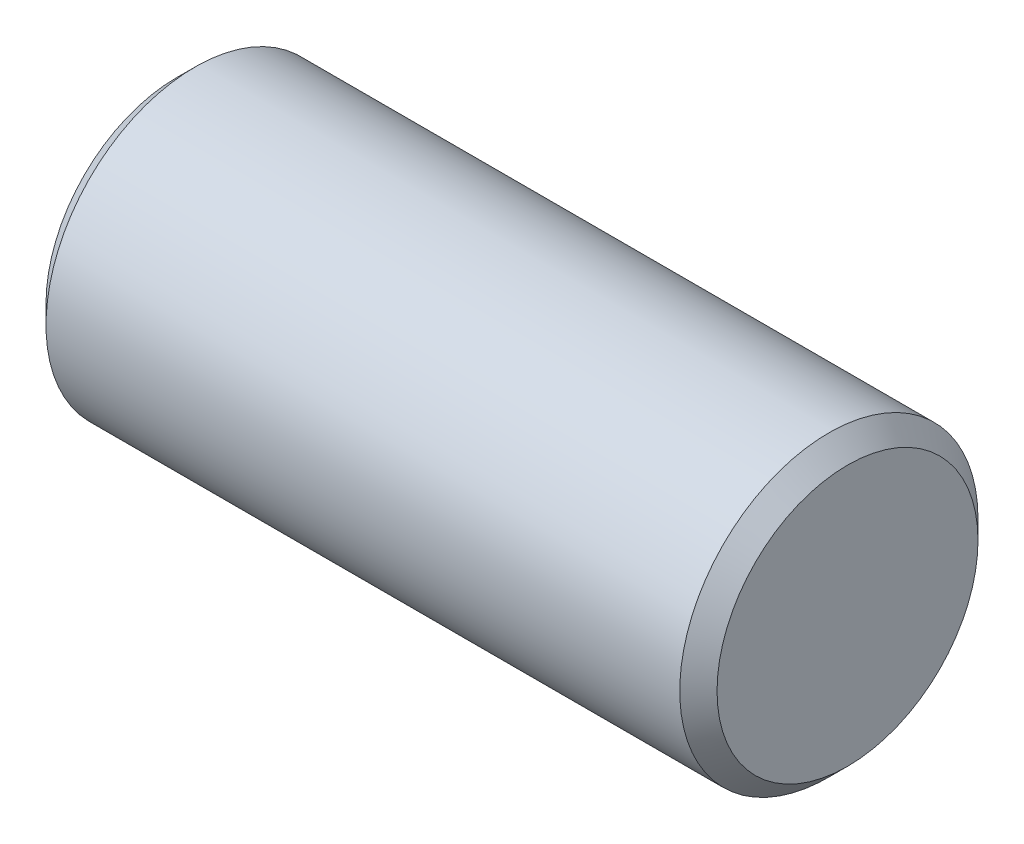
ISO-10303-21;
HEADER;
FILE_DESCRIPTION(('STEP AP214'),'2;1');
FILE_NAME('part.step','',(''),(''),'','','');
FILE_SCHEMA(('AUTOMOTIVE_DESIGN { 1 0 10303 214 1 1 1 1 }'));
ENDSEC;
DATA;
#1=APPLICATION_CONTEXT('core data for automotive mechanical design processes');
#2=APPLICATION_PROTOCOL_DEFINITION('international standard','automotive_design',2000,#1);
#3=PRODUCT_CONTEXT('',#1,'mechanical');
#4=PRODUCT('Part','Part','',(#3));
#5=PRODUCT_RELATED_PRODUCT_CATEGORY('part','',(#4));
#6=PRODUCT_DEFINITION_FORMATION('','',#4);
#7=PRODUCT_DEFINITION_CONTEXT('part definition',#1,'design');
#8=PRODUCT_DEFINITION('design','',#6,#7);
#9=PRODUCT_DEFINITION_SHAPE('','',#8);
#10=(LENGTH_UNIT() NAMED_UNIT(*) SI_UNIT(.MILLI.,.METRE.));
#11=(NAMED_UNIT(*) PLANE_ANGLE_UNIT() SI_UNIT($,.RADIAN.));
#12=(NAMED_UNIT(*) SI_UNIT($,.STERADIAN.) SOLID_ANGLE_UNIT());
#13=UNCERTAINTY_MEASURE_WITH_UNIT(LENGTH_MEASURE(1.E-05),#10,'distance_accuracy_value','');
#14=(GEOMETRIC_REPRESENTATION_CONTEXT(3) GLOBAL_UNCERTAINTY_ASSIGNED_CONTEXT((#13)) GLOBAL_UNIT_ASSIGNED_CONTEXT((#10,
#11,#12)) REPRESENTATION_CONTEXT('',''));
#15=CARTESIAN_POINT('',(0.,0.,0.));
#16=DIRECTION('',(0.,0.,1.));
#17=DIRECTION('',(1.,0.,0.));
#18=AXIS2_PLACEMENT_3D('',#15,#16,#17);
#19=CARTESIAN_POINT('',(18.,0.,0.));
#20=DIRECTION('',(-1.,0.,0.));
#21=DIRECTION('',(0.,0.,1.));
#22=AXIS2_PLACEMENT_3D('',#19,#20,#21);
#23=CYLINDRICAL_SURFACE('',#22,4.);
#24=CARTESIAN_POINT('',(17.5,0.,0.));
#25=DIRECTION('',(1.,0.,0.));
#26=DIRECTION('',(0.,0.,-1.));
#27=AXIS2_PLACEMENT_3D('',#24,#25,#26);
#28=CIRCLE('',#27,4.);
#29=CARTESIAN_POINT('',(17.5,0.,-4.));
#30=VERTEX_POINT('',#29);
#31=EDGE_CURVE('E48',#30,#30,#28,.F.);
#32=ORIENTED_EDGE('',*,*,#31,.T.);
#33=EDGE_LOOP('',(#32));
#34=FACE_BOUND('',#33,.T.);
#35=CARTESIAN_POINT('',(0.5,0.,0.));
#36=DIRECTION('',(1.,0.,0.));
#37=DIRECTION('',(0.,0.,-1.));
#38=AXIS2_PLACEMENT_3D('',#35,#36,#37);
#39=CIRCLE('',#38,4.);
#40=CARTESIAN_POINT('',(0.5,0.,-4.));
#41=VERTEX_POINT('',#40);
#42=EDGE_CURVE('E53',#41,#41,#39,.T.);
#43=ORIENTED_EDGE('',*,*,#42,.T.);
#44=EDGE_LOOP('',(#43));
#45=FACE_BOUND('',#44,.T.);
#46=ADVANCED_FACE('F39',(#34,#45),#23,.T.);
#47=CARTESIAN_POINT('',(18.,0.,0.));
#48=DIRECTION('',(1.,0.,0.));
#49=DIRECTION('',(0.,0.,-1.));
#50=AXIS2_PLACEMENT_3D('',#47,#48,#49);
#51=PLANE('',#50);
#52=CARTESIAN_POINT('',(18.,0.,0.));
#53=DIRECTION('',(1.,0.,0.));
#54=DIRECTION('',(0.,0.,-1.));
#55=AXIS2_PLACEMENT_3D('',#52,#53,#54);
#56=CIRCLE('',#55,3.5);
#57=CARTESIAN_POINT('',(18.,0.,-3.5));
#58=VERTEX_POINT('',#57);
#59=EDGE_CURVE('E58',#58,#58,#56,.T.);
#60=ORIENTED_EDGE('',*,*,#59,.T.);
#61=EDGE_LOOP('',(#60));
#62=FACE_BOUND('',#61,.T.);
#63=ADVANCED_FACE('F65',(#62),#51,.T.);
#64=CARTESIAN_POINT('',(0.,0.,0.));
#65=DIRECTION('',(1.,0.,0.));
#66=DIRECTION('',(0.,0.,-1.));
#67=AXIS2_PLACEMENT_3D('',#64,#65,#66);
#68=PLANE('',#67);
#69=CARTESIAN_POINT('',(0.,0.,0.));
#70=DIRECTION('',(1.,0.,0.));
#71=DIRECTION('',(0.,0.,-1.));
#72=AXIS2_PLACEMENT_3D('',#69,#70,#71);
#73=CIRCLE('',#72,3.5);
#74=CARTESIAN_POINT('',(0.,0.,-3.5));
#75=VERTEX_POINT('',#74);
#76=EDGE_CURVE('E10',#75,#75,#73,.F.);
#77=ORIENTED_EDGE('',*,*,#76,.T.);
#78=EDGE_LOOP('',(#77));
#79=FACE_BOUND('',#78,.T.);
#80=ADVANCED_FACE('F69',(#79),#68,.F.);
#81=CARTESIAN_POINT('',(18.,0.,0.));
#82=DIRECTION('',(-1.,0.,0.));
#83=DIRECTION('',(0.,0.,1.));
#84=AXIS2_PLACEMENT_3D('',#81,#82,#83);
#85=CONICAL_SURFACE('',#84,3.5,0.785398163397445);
#86=ORIENTED_EDGE('',*,*,#31,.F.);
#87=EDGE_LOOP('',(#86));
#88=FACE_BOUND('',#87,.T.);
#89=ORIENTED_EDGE('',*,*,#59,.F.);
#90=EDGE_LOOP('',(#89));
#91=FACE_BOUND('',#90,.T.);
#92=ADVANCED_FACE('F67',(#88,#91),#85,.T.);
#93=CARTESIAN_POINT('',(0.5,0.,0.));
#94=DIRECTION('',(1.,0.,0.));
#95=DIRECTION('',(0.,0.,-1.));
#96=AXIS2_PLACEMENT_3D('',#93,#94,#95);
#97=CONICAL_SURFACE('',#96,4.,0.785398163397452);
#98=ORIENTED_EDGE('',*,*,#76,.F.);
#99=EDGE_LOOP('',(#98));
#100=FACE_BOUND('',#99,.T.);
#101=ORIENTED_EDGE('',*,*,#42,.F.);
#102=EDGE_LOOP('',(#101));
#103=FACE_BOUND('',#102,.T.);
#104=ADVANCED_FACE('F42',(#100,#103),#97,.T.);
#105=CLOSED_SHELL('',(#46,#63,#80,#92,#104));
#106=MANIFOLD_SOLID_BREP('B2',#105);
#107=ADVANCED_BREP_SHAPE_REPRESENTATION('',(#18,#106),#14);
#108=SHAPE_DEFINITION_REPRESENTATION(#9,#107);
ENDSEC;
END-ISO-10303-21;
